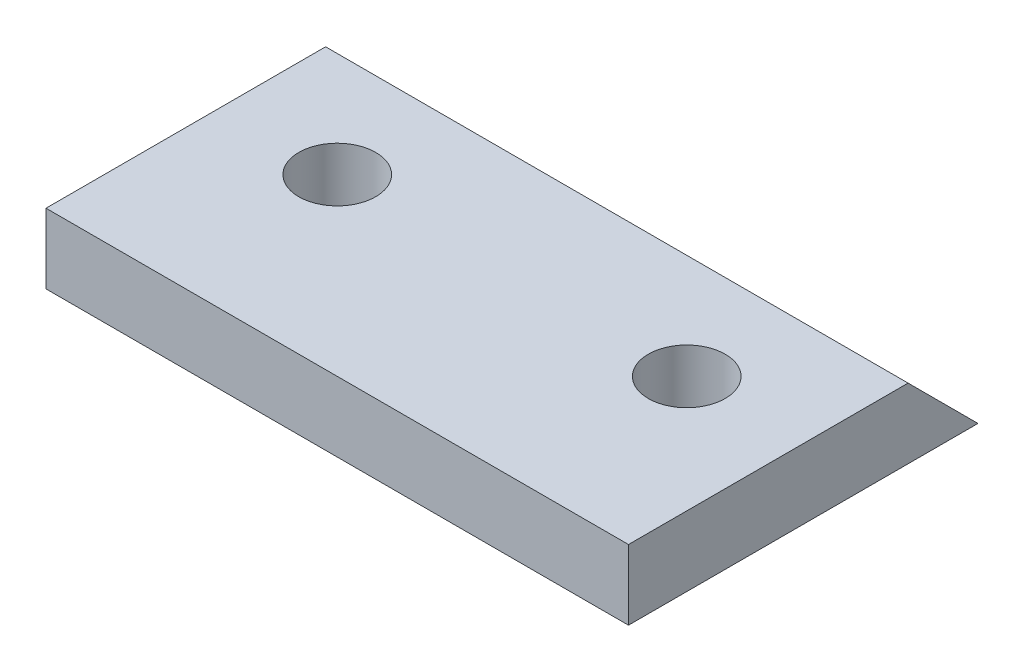
ISO-10303-21;
HEADER;
FILE_DESCRIPTION(('STEP AP214'),'2;1');
FILE_NAME('part.step','',(''),(''),'','','');
FILE_SCHEMA(('AUTOMOTIVE_DESIGN { 1 0 10303 214 1 1 1 1 }'));
ENDSEC;
DATA;
#1=APPLICATION_CONTEXT('core data for automotive mechanical design processes');
#2=APPLICATION_PROTOCOL_DEFINITION('international standard','automotive_design',2000,#1);
#3=PRODUCT_CONTEXT('',#1,'mechanical');
#4=PRODUCT('Part','Part','',(#3));
#5=PRODUCT_RELATED_PRODUCT_CATEGORY('part','',(#4));
#6=PRODUCT_DEFINITION_FORMATION('','',#4);
#7=PRODUCT_DEFINITION_CONTEXT('part definition',#1,'design');
#8=PRODUCT_DEFINITION('design','',#6,#7);
#9=PRODUCT_DEFINITION_SHAPE('','',#8);
#10=(LENGTH_UNIT() NAMED_UNIT(*) SI_UNIT(.MILLI.,.METRE.));
#11=(NAMED_UNIT(*) PLANE_ANGLE_UNIT() SI_UNIT($,.RADIAN.));
#12=(NAMED_UNIT(*) SI_UNIT($,.STERADIAN.) SOLID_ANGLE_UNIT());
#13=UNCERTAINTY_MEASURE_WITH_UNIT(LENGTH_MEASURE(1.E-05),#10,'distance_accuracy_value','');
#14=(GEOMETRIC_REPRESENTATION_CONTEXT(3) GLOBAL_UNCERTAINTY_ASSIGNED_CONTEXT((#13)) GLOBAL_UNIT_ASSIGNED_CONTEXT((#10,
#11,#12)) REPRESENTATION_CONTEXT('',''));
#15=CARTESIAN_POINT('',(0.,0.,0.));
#16=DIRECTION('',(0.,0.,1.));
#17=DIRECTION('',(1.,0.,0.));
#18=AXIS2_PLACEMENT_3D('',#15,#16,#17);
#19=CARTESIAN_POINT('',(12.5,3.,7.5));
#20=DIRECTION('',(-1.,0.,0.));
#21=DIRECTION('',(0.,0.,1.));
#22=AXIS2_PLACEMENT_3D('',#19,#20,#21);
#23=PLANE('',#22);
#24=DIRECTION('',(0.,0.,-1.));
#25=VECTOR('',#24,1.);
#26=CARTESIAN_POINT('',(12.5,0.,7.5));
#27=LINE('',#26,#25);
#28=CARTESIAN_POINT('',(12.5,0.,7.5));
#29=VERTEX_POINT('',#28);
#30=CARTESIAN_POINT('',(12.5,0.,-7.5));
#31=VERTEX_POINT('',#30);
#32=EDGE_CURVE('E116',#29,#31,#27,.T.);
#33=ORIENTED_EDGE('',*,*,#32,.T.);
#34=DIRECTION('',(0.,-0.707106781186549,-0.707106781186546));
#35=VECTOR('',#34,1.);
#36=CARTESIAN_POINT('',(12.5,3.,-4.5));
#37=LINE('',#36,#35);
#38=CARTESIAN_POINT('',(12.5,3.,-4.5));
#39=VERTEX_POINT('',#38);
#40=EDGE_CURVE('E11',#31,#39,#37,.F.);
#41=ORIENTED_EDGE('',*,*,#40,.T.);
#42=DIRECTION('',(0.,0.,-1.));
#43=VECTOR('',#42,1.);
#44=CARTESIAN_POINT('',(12.5,3.,7.5));
#45=LINE('',#44,#43);
#46=CARTESIAN_POINT('',(12.5,3.,7.5));
#47=VERTEX_POINT('',#46);
#48=EDGE_CURVE('E96',#47,#39,#45,.T.);
#49=ORIENTED_EDGE('',*,*,#48,.F.);
#50=DIRECTION('',(0.,-1.,0.));
#51=VECTOR('',#50,1.);
#52=CARTESIAN_POINT('',(12.5,3.,7.5));
#53=LINE('',#52,#51);
#54=EDGE_CURVE('E106',#47,#29,#53,.T.);
#55=ORIENTED_EDGE('',*,*,#54,.T.);
#56=EDGE_LOOP('',(#33,#41,#49,#55));
#57=FACE_BOUND('',#56,.T.);
#58=ADVANCED_FACE('F45',(#57),#23,.F.);
#59=CARTESIAN_POINT('',(-12.5,3.,7.5));
#60=DIRECTION('',(1.,0.,0.));
#61=DIRECTION('',(0.,0.,-1.));
#62=AXIS2_PLACEMENT_3D('',#59,#60,#61);
#63=PLANE('',#62);
#64=DIRECTION('',(0.,0.,1.));
#65=VECTOR('',#64,1.);
#66=CARTESIAN_POINT('',(-12.5,3.,7.5));
#67=LINE('',#66,#65);
#68=CARTESIAN_POINT('',(-12.5,3.,-4.5));
#69=VERTEX_POINT('',#68);
#70=CARTESIAN_POINT('',(-12.5,3.,7.5));
#71=VERTEX_POINT('',#70);
#72=EDGE_CURVE('E87',#69,#71,#67,.T.);
#73=ORIENTED_EDGE('',*,*,#72,.F.);
#74=DIRECTION('',(0.,0.707106781186549,0.707106781186546));
#75=VECTOR('',#74,1.);
#76=CARTESIAN_POINT('',(-12.5,3.,-4.5));
#77=LINE('',#76,#75);
#78=CARTESIAN_POINT('',(-12.5,0.,-7.5));
#79=VERTEX_POINT('',#78);
#80=EDGE_CURVE('E55',#69,#79,#77,.F.);
#81=ORIENTED_EDGE('',*,*,#80,.T.);
#82=DIRECTION('',(0.,0.,1.));
#83=VECTOR('',#82,1.);
#84=CARTESIAN_POINT('',(-12.5,0.,7.5));
#85=LINE('',#84,#83);
#86=CARTESIAN_POINT('',(-12.5,0.,7.5));
#87=VERTEX_POINT('',#86);
#88=EDGE_CURVE('E102',#79,#87,#85,.T.);
#89=ORIENTED_EDGE('',*,*,#88,.T.);
#90=DIRECTION('',(0.,-1.,0.));
#91=VECTOR('',#90,1.);
#92=CARTESIAN_POINT('',(-12.5,3.,7.5));
#93=LINE('',#92,#91);
#94=EDGE_CURVE('E99',#71,#87,#93,.T.);
#95=ORIENTED_EDGE('',*,*,#94,.F.);
#96=EDGE_LOOP('',(#73,#81,#89,#95));
#97=FACE_BOUND('',#96,.T.);
#98=ADVANCED_FACE('F100',(#97),#63,.F.);
#99=CARTESIAN_POINT('',(-12.5,3.,7.5));
#100=DIRECTION('',(0.,0.,-1.));
#101=DIRECTION('',(-1.,0.,0.));
#102=AXIS2_PLACEMENT_3D('',#99,#100,#101);
#103=PLANE('',#102);
#104=DIRECTION('',(1.,0.,0.));
#105=VECTOR('',#104,1.);
#106=CARTESIAN_POINT('',(-12.5,0.,7.5));
#107=LINE('',#106,#105);
#108=EDGE_CURVE('E125',#87,#29,#107,.T.);
#109=ORIENTED_EDGE('',*,*,#108,.T.);
#110=ORIENTED_EDGE('',*,*,#54,.F.);
#111=DIRECTION('',(1.,0.,0.));
#112=VECTOR('',#111,1.);
#113=CARTESIAN_POINT('',(-12.5,3.,7.5));
#114=LINE('',#113,#112);
#115=EDGE_CURVE('E91',#71,#47,#114,.T.);
#116=ORIENTED_EDGE('',*,*,#115,.F.);
#117=ORIENTED_EDGE('',*,*,#94,.T.);
#118=EDGE_LOOP('',(#109,#110,#116,#117));
#119=FACE_BOUND('',#118,.T.);
#120=ADVANCED_FACE('F108',(#119),#103,.F.);
#121=CARTESIAN_POINT('',(0.,3.,0.));
#122=DIRECTION('',(0.,-1.,0.));
#123=DIRECTION('',(0.,0.,-1.));
#124=AXIS2_PLACEMENT_3D('',#121,#122,#123);
#125=PLANE('',#124);
#126=CARTESIAN_POINT('',(-7.5,3.,0.));
#127=DIRECTION('',(0.,1.,0.));
#128=DIRECTION('',(0.,0.,1.));
#129=AXIS2_PLACEMENT_3D('',#126,#127,#128);
#130=CIRCLE('',#129,1.65);
#131=CARTESIAN_POINT('',(-7.5,3.,1.65));
#132=VERTEX_POINT('',#131);
#133=EDGE_CURVE('E173',#132,#132,#130,.T.);
#134=ORIENTED_EDGE('',*,*,#133,.F.);
#135=EDGE_LOOP('',(#134));
#136=FACE_BOUND('',#135,.T.);
#137=CARTESIAN_POINT('',(7.5,3.,0.));
#138=DIRECTION('',(0.,1.,0.));
#139=DIRECTION('',(0.,0.,1.));
#140=AXIS2_PLACEMENT_3D('',#137,#138,#139);
#141=CIRCLE('',#140,1.65);
#142=CARTESIAN_POINT('',(7.5,3.,1.65));
#143=VERTEX_POINT('',#142);
#144=EDGE_CURVE('E164',#143,#143,#141,.T.);
#145=ORIENTED_EDGE('',*,*,#144,.F.);
#146=EDGE_LOOP('',(#145));
#147=FACE_BOUND('',#146,.T.);
#148=ORIENTED_EDGE('',*,*,#48,.T.);
#149=DIRECTION('',(-1.,0.,0.));
#150=VECTOR('',#149,1.);
#151=CARTESIAN_POINT('',(0.,3.,-4.5));
#152=LINE('',#151,#150);
#153=EDGE_CURVE('E93',#39,#69,#152,.T.);
#154=ORIENTED_EDGE('',*,*,#153,.T.);
#155=ORIENTED_EDGE('',*,*,#72,.T.);
#156=ORIENTED_EDGE('',*,*,#115,.T.);
#157=EDGE_LOOP('',(#148,#154,#155,#156));
#158=FACE_BOUND('',#157,.T.);
#159=ADVANCED_FACE('F89',(#136,#147,#158),#125,.F.);
#160=CARTESIAN_POINT('',(0.,0.,0.));
#161=DIRECTION('',(0.,-1.,0.));
#162=DIRECTION('',(0.,0.,-1.));
#163=AXIS2_PLACEMENT_3D('',#160,#161,#162);
#164=PLANE('',#163);
#165=CARTESIAN_POINT('',(-7.5,0.,0.));
#166=DIRECTION('',(0.,1.,0.));
#167=DIRECTION('',(0.,0.,1.));
#168=AXIS2_PLACEMENT_3D('',#165,#166,#167);
#169=CIRCLE('',#168,1.65);
#170=CARTESIAN_POINT('',(-7.5,0.,1.65));
#171=VERTEX_POINT('',#170);
#172=EDGE_CURVE('E167',#171,#171,#169,.T.);
#173=ORIENTED_EDGE('',*,*,#172,.T.);
#174=EDGE_LOOP('',(#173));
#175=FACE_BOUND('',#174,.T.);
#176=CARTESIAN_POINT('',(7.5,0.,0.));
#177=DIRECTION('',(0.,1.,0.));
#178=DIRECTION('',(0.,0.,1.));
#179=AXIS2_PLACEMENT_3D('',#176,#177,#178);
#180=CIRCLE('',#179,1.65);
#181=CARTESIAN_POINT('',(7.5,0.,1.65));
#182=VERTEX_POINT('',#181);
#183=EDGE_CURVE('E120',#182,#182,#180,.T.);
#184=ORIENTED_EDGE('',*,*,#183,.T.);
#185=EDGE_LOOP('',(#184));
#186=FACE_BOUND('',#185,.T.);
#187=ORIENTED_EDGE('',*,*,#32,.F.);
#188=ORIENTED_EDGE('',*,*,#108,.F.);
#189=ORIENTED_EDGE('',*,*,#88,.F.);
#190=DIRECTION('',(-1.,0.,0.));
#191=VECTOR('',#190,1.);
#192=CARTESIAN_POINT('',(-12.5,0.,-7.5));
#193=LINE('',#192,#191);
#194=EDGE_CURVE('E119',#31,#79,#193,.T.);
#195=ORIENTED_EDGE('',*,*,#194,.F.);
#196=EDGE_LOOP('',(#187,#188,#189,#195));
#197=FACE_BOUND('',#196,.T.);
#198=ADVANCED_FACE('F132',(#175,#186,#197),#164,.T.);
#199=CARTESIAN_POINT('',(7.5,3.,0.));
#200=DIRECTION('',(0.,1.,0.));
#201=DIRECTION('',(0.,0.,1.));
#202=AXIS2_PLACEMENT_3D('',#199,#200,#201);
#203=CYLINDRICAL_SURFACE('',#202,1.65);
#204=ORIENTED_EDGE('',*,*,#183,.F.);
#205=EDGE_LOOP('',(#204));
#206=FACE_BOUND('',#205,.T.);
#207=ORIENTED_EDGE('',*,*,#144,.T.);
#208=EDGE_LOOP('',(#207));
#209=FACE_BOUND('',#208,.T.);
#210=ADVANCED_FACE('F138',(#206,#209),#203,.F.);
#211=CARTESIAN_POINT('',(-7.5,3.,0.));
#212=DIRECTION('',(0.,1.,0.));
#213=DIRECTION('',(0.,0.,1.));
#214=AXIS2_PLACEMENT_3D('',#211,#212,#213);
#215=CYLINDRICAL_SURFACE('',#214,1.65);
#216=ORIENTED_EDGE('',*,*,#172,.F.);
#217=EDGE_LOOP('',(#216));
#218=FACE_BOUND('',#217,.T.);
#219=ORIENTED_EDGE('',*,*,#133,.T.);
#220=EDGE_LOOP('',(#219));
#221=FACE_BOUND('',#220,.T.);
#222=ADVANCED_FACE('F134',(#218,#221),#215,.F.);
#223=CARTESIAN_POINT('',(0.,3.,-4.5));
#224=DIRECTION('',(0.,-0.707106781186546,0.707106781186549));
#225=DIRECTION('',(-1.,0.,0.));
#226=AXIS2_PLACEMENT_3D('',#223,#224,#225);
#227=PLANE('',#226);
#228=ORIENTED_EDGE('',*,*,#40,.F.);
#229=ORIENTED_EDGE('',*,*,#194,.T.);
#230=ORIENTED_EDGE('',*,*,#80,.F.);
#231=ORIENTED_EDGE('',*,*,#153,.F.);
#232=EDGE_LOOP('',(#228,#229,#230,#231));
#233=FACE_BOUND('',#232,.T.);
#234=ADVANCED_FACE('F48',(#233),#227,.F.);
#235=CLOSED_SHELL('',(#58,#98,#120,#159,#198,#210,#222,#234));
#236=MANIFOLD_SOLID_BREP('B2',#235);
#237=ADVANCED_BREP_SHAPE_REPRESENTATION('',(#18,#236),#14);
#238=SHAPE_DEFINITION_REPRESENTATION(#9,#237);
ENDSEC;
END-ISO-10303-21;
